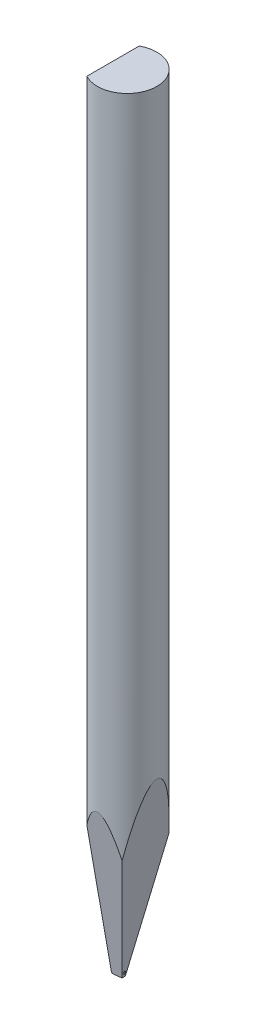
ISO-10303-21;
HEADER;
FILE_DESCRIPTION(('STEP AP214'),'2;1');
FILE_NAME('part.step','',(''),(''),'','','');
FILE_SCHEMA(('AUTOMOTIVE_DESIGN { 1 0 10303 214 1 1 1 1 }'));
ENDSEC;
DATA;
#1=APPLICATION_CONTEXT('core data for automotive mechanical design processes');
#2=APPLICATION_PROTOCOL_DEFINITION('international standard','automotive_design',2000,#1);
#3=PRODUCT_CONTEXT('',#1,'mechanical');
#4=PRODUCT('Part','Part','',(#3));
#5=PRODUCT_RELATED_PRODUCT_CATEGORY('part','',(#4));
#6=PRODUCT_DEFINITION_FORMATION('','',#4);
#7=PRODUCT_DEFINITION_CONTEXT('part definition',#1,'design');
#8=PRODUCT_DEFINITION('design','',#6,#7);
#9=PRODUCT_DEFINITION_SHAPE('','',#8);
#10=(LENGTH_UNIT() NAMED_UNIT(*) SI_UNIT(.MILLI.,.METRE.));
#11=(NAMED_UNIT(*) PLANE_ANGLE_UNIT() SI_UNIT($,.RADIAN.));
#12=(NAMED_UNIT(*) SI_UNIT($,.STERADIAN.) SOLID_ANGLE_UNIT());
#13=UNCERTAINTY_MEASURE_WITH_UNIT(LENGTH_MEASURE(1.E-05),#10,'distance_accuracy_value','');
#14=(GEOMETRIC_REPRESENTATION_CONTEXT(3) GLOBAL_UNCERTAINTY_ASSIGNED_CONTEXT((#13)) GLOBAL_UNIT_ASSIGNED_CONTEXT((#10,
#11,#12)) REPRESENTATION_CONTEXT('',''));
#15=CARTESIAN_POINT('',(0.,0.,0.));
#16=DIRECTION('',(0.,0.,1.));
#17=DIRECTION('',(1.,0.,0.));
#18=AXIS2_PLACEMENT_3D('',#15,#16,#17);
#19=CARTESIAN_POINT('',(-0.29972,0.,27.2760283406468));
#20=DIRECTION('',(-0.139173100960066,0.99026806874157,0.));
#21=DIRECTION('',(-0.99026806874157,-0.139173100960066,0.));
#22=AXIS2_PLACEMENT_3D('',#19,#20,#21);
#23=PLANE('',#22);
#24=DIRECTION('',(-0.99026806874157,-0.139173100960066,0.));
#25=VECTOR('',#24,1.);
#26=CARTESIAN_POINT('',(-0.29972,0.,0.0190499999999996));
#27=LINE('',#26,#25);
#28=CARTESIAN_POINT('',(-0.182120032,0.0165275976636946,0.0190499999999998));
#29=VERTEX_POINT('',#28);
#30=CARTESIAN_POINT('',(-0.284229745342368,0.00217701331933743,0.01905));
#31=VERTEX_POINT('',#30);
#32=EDGE_CURVE('E183',#29,#31,#27,.T.);
#33=ORIENTED_EDGE('',*,*,#32,.F.);
#34=DIRECTION('',(0.,0.,1.));
#35=VECTOR('',#34,1.);
#36=CARTESIAN_POINT('',(-0.182120032,0.0165275976636946,27.2760283406468));
#37=LINE('',#36,#35);
#38=CARTESIAN_POINT('',(-0.182120032,0.0165275976636946,-0.0190499999999998));
#39=VERTEX_POINT('',#38);
#40=EDGE_CURVE('E11',#39,#29,#37,.T.);
#41=ORIENTED_EDGE('',*,*,#40,.F.);
#42=DIRECTION('',(-0.99026806874157,-0.139173100960066,0.));
#43=VECTOR('',#42,1.);
#44=CARTESIAN_POINT('',(-0.29972,0.,-0.0190499999999996));
#45=LINE('',#44,#43);
#46=CARTESIAN_POINT('',(-0.284229745342368,0.00217701331933743,-0.01905));
#47=VERTEX_POINT('',#46);
#48=EDGE_CURVE('E147',#39,#47,#45,.T.);
#49=ORIENTED_EDGE('',*,*,#48,.T.);
#50=CARTESIAN_POINT('',(-1.76000710043308,-0.205229968,0.));
#51=DIRECTION('',(-0.139173100960066,0.99026806874157,0.));
#52=DIRECTION('',(-0.99026806874157,-0.139173100960066,0.));
#53=AXIS2_PLACEMENT_3D('',#50,#51,#52);
#54=ELLIPSE('',#53,1.49655356216977,0.20828);
#55=CARTESIAN_POINT('',(-0.29972000000001,0.,-0.035513640122057));
#56=VERTEX_POINT('',#55);
#57=EDGE_CURVE('E189',#47,#56,#54,.T.);
#58=ORIENTED_EDGE('',*,*,#57,.T.);
#59=DIRECTION('',(0.,0.,-1.));
#60=VECTOR('',#59,1.);
#61=CARTESIAN_POINT('',(-0.29972,0.,27.2760283406468));
#62=LINE('',#61,#60);
#63=CARTESIAN_POINT('',(-0.299719999999996,0.,-0.0381));
#64=VERTEX_POINT('',#63);
#65=EDGE_CURVE('E207',#56,#64,#62,.T.);
#66=ORIENTED_EDGE('',*,*,#65,.T.);
#67=DIRECTION('',(0.98997002855162,0.139131214142995,-0.0245325869121374));
#68=VECTOR('',#67,1.);
#69=CARTESIAN_POINT('',(26.3315049185651,3.74277457920228,-0.698052141023137));
#70=LINE('',#69,#68);
#71=CARTESIAN_POINT('',(-0.0913565150909437,0.0292835780906194,-0.0432634849090593));
#72=VERTEX_POINT('',#71);
#73=EDGE_CURVE('E249',#64,#72,#70,.T.);
#74=ORIENTED_EDGE('',*,*,#73,.T.);
#75=DIRECTION('',(0.,0.,-1.));
#76=VECTOR('',#75,1.);
#77=CARTESIAN_POINT('',(-0.0913565150909408,0.0292835780906184,27.2760283406468));
#78=LINE('',#77,#76);
#79=CARTESIAN_POINT('',(-0.0913565150909437,0.0292835780906194,0.0432634849090593));
#80=VERTEX_POINT('',#79);
#81=EDGE_CURVE('E204',#80,#72,#78,.T.);
#82=ORIENTED_EDGE('',*,*,#81,.F.);
#83=DIRECTION('',(-0.98997002855162,-0.139131214142995,-0.0245325869121374));
#84=VECTOR('',#83,1.);
#85=CARTESIAN_POINT('',(26.3315049185651,3.74277457920228,0.698052141023137));
#86=LINE('',#85,#84);
#87=CARTESIAN_POINT('',(-0.299719999999996,0.,0.0381));
#88=VERTEX_POINT('',#87);
#89=EDGE_CURVE('E217',#80,#88,#86,.T.);
#90=ORIENTED_EDGE('',*,*,#89,.T.);
#91=CARTESIAN_POINT('',(-0.29972000000001,0.,0.035513640122057));
#92=VERTEX_POINT('',#91);
#93=EDGE_CURVE('E208',#88,#92,#62,.T.);
#94=ORIENTED_EDGE('',*,*,#93,.T.);
#95=EDGE_CURVE('E191',#92,#31,#54,.T.);
#96=ORIENTED_EDGE('',*,*,#95,.T.);
#97=EDGE_LOOP('',(#33,#41,#49,#58,#66,#74,#82,#90,#94,#96));
#98=FACE_BOUND('',#97,.T.);
#99=ADVANCED_FACE('F43',(#98),#23,.F.);
#100=CARTESIAN_POINT('',(26.8421219491216,-0.205229968,0.));
#101=DIRECTION('',(-1.,0.,0.));
#102=DIRECTION('',(0.,0.,1.));
#103=AXIS2_PLACEMENT_3D('',#100,#101,#102);
#104=CYLINDRICAL_SURFACE('',#103,0.20828);
#105=DIRECTION('',(-1.,0.,0.));
#106=VECTOR('',#105,1.);
#107=CARTESIAN_POINT('',(26.8421219491216,0.00217701331933743,0.01905));
#108=LINE('',#107,#106);
#109=CARTESIAN_POINT('',(-0.296326350508201,0.00217701331934075,0.01905));
#110=VERTEX_POINT('',#109);
#111=EDGE_CURVE('E51',#31,#110,#108,.T.);
#112=ORIENTED_EDGE('',*,*,#111,.F.);
#113=ORIENTED_EDGE('',*,*,#95,.F.);
#114=DIRECTION('',(-1.,0.,0.));
#115=VECTOR('',#114,1.);
#116=CARTESIAN_POINT('',(26.8421219491216,0.,0.035513640122057));
#117=LINE('',#116,#115);
#118=CARTESIAN_POINT('',(-0.35052,0.,0.0355136401220951));
#119=VERTEX_POINT('',#118);
#120=EDGE_CURVE('E66',#92,#119,#117,.T.);
#121=ORIENTED_EDGE('',*,*,#120,.T.);
#122=CARTESIAN_POINT('',(-0.35052,0.,-0.0355136401220637));
#123=CARTESIAN_POINT('',(-0.350797395604418,-1.57400676627364E-07,-0.0355144568911877));
#124=CARTESIAN_POINT('',(-0.351073642816387,4.5377827047496E-06,-0.035487421708618));
#125=CARTESIAN_POINT('',(-0.351613263825735,2.21644221869214E-05,-0.0353853757902136));
#126=CARTESIAN_POINT('',(-0.351876759101891,3.49868149283125E-05,-0.0353110002844949));
#127=CARTESIAN_POINT('',(-0.35244979870468,7.13960743479532E-05,-0.0350987402298029));
#128=CARTESIAN_POINT('',(-0.35275505892223,9.68368252018304E-05,-0.034949843353549));
#129=CARTESIAN_POINT('',(-0.353338531097127,0.000155153990777931,-0.0346055071548817));
#130=CARTESIAN_POINT('',(-0.353616586126976,0.000188070279649302,-0.0344098179371281));
#131=CARTESIAN_POINT('',(-0.354322814135869,0.000282300913829212,-0.0338436443460087));
#132=CARTESIAN_POINT('',(-0.354726685485515,0.000347861473302922,-0.0334439163823284));
#133=CARTESIAN_POINT('',(-0.355472412413751,0.000484639813457646,-0.0325921696743602));
#134=CARTESIAN_POINT('',(-0.355814128424397,0.000555869821860981,-0.0321400368917526));
#135=CARTESIAN_POINT('',(-0.356974805419614,0.000818253829038452,-0.0304340274839467));
#136=CARTESIAN_POINT('',(-0.357652464954569,0.00101363589256459,-0.0290865433357066));
#137=CARTESIAN_POINT('',(-0.358817371111136,0.00138636623825021,-0.0263111620333282));
#138=CARTESIAN_POINT('',(-0.359303570197177,0.0015636114869725,-0.0248828700930591));
#139=CARTESIAN_POINT('',(-0.360894436268654,0.00217904710937099,-0.019443057777476));
#140=CARTESIAN_POINT('',(-0.361584668102874,0.00252849923342408,-0.0153023761550464));
#141=CARTESIAN_POINT('',(-0.362456628024893,0.00297714715962812,-0.00694333703675725));
#142=CARTESIAN_POINT('',(-0.362634670426027,0.00307452857573046,-0.00272463532371374));
#143=CARTESIAN_POINT('',(-0.362518404096607,0.0030130988304252,0.00595582510285886));
#144=CARTESIAN_POINT('',(-0.362194686999288,0.00283833421565539,0.010416749562991));
#145=CARTESIAN_POINT('',(-0.36091600701626,0.00220673224075402,0.0192117898923717));
#146=CARTESIAN_POINT('',(-0.359970737827828,0.00175423350911561,0.0235468022648287));
#147=CARTESIAN_POINT('',(-0.358048099187581,0.00114038766389879,0.0281458568754849));
#148=CARTESIAN_POINT('',(-0.357795803676435,0.00106283259586748,0.0287081317721685));
#149=CARTESIAN_POINT('',(-0.357249650864011,0.000905955011840022,0.0298135012280328));
#150=CARTESIAN_POINT('',(-0.356955715689955,0.000826629424335999,0.0303565574112618));
#151=CARTESIAN_POINT('',(-0.356315014780153,0.000667698813082343,0.0314165582917925));
#152=CARTESIAN_POINT('',(-0.355967871556471,0.000588096114296238,0.031933278166191));
#153=CARTESIAN_POINT('',(-0.355207020712523,0.000433153557137812,0.0329162976166374));
#154=CARTESIAN_POINT('',(-0.354793509697868,0.000357801970001448,0.033382739514937));
#155=CARTESIAN_POINT('',(-0.354100819675329,0.000252552869997975,0.034022672869181));
#156=CARTESIAN_POINT('',(-0.353852907593938,0.000218246965712038,0.0342290325488683));
#157=CARTESIAN_POINT('',(-0.353331597329311,0.000154725960642612,0.0346081270678385));
#158=CARTESIAN_POINT('',(-0.353058216503108,0.00012550743119591,0.0347808845627593));
#159=CARTESIAN_POINT('',(-0.352527407592248,7.82570555704721E-05,0.0350586395909549));
#160=CARTESIAN_POINT('',(-0.352273343313951,5.92205484808112E-05,0.0351698100115295));
#161=CARTESIAN_POINT('',(-0.351750156654139,2.84660364555167E-05,0.0353488626663096));
#162=CARTESIAN_POINT('',(-0.35148107897909,1.6727447593476E-05,0.0354168666637885));
#163=CARTESIAN_POINT('',(-0.351094473723724,6.23977938820673E-06,0.0354775660166442));
#164=CARTESIAN_POINT('',(-0.350980076378248,3.9077513811912E-06,0.035491051824929));
#165=CARTESIAN_POINT('',(-0.3507504739734,7.85967139598533E-07,0.0355090985386168));
#166=CARTESIAN_POINT('',(-0.350635268369774,-2.62422891388475E-09,0.0355136527031143));
#167=CARTESIAN_POINT('',(-0.350520000000007,0.,0.0355136401220959));
#168=B_SPLINE_CURVE_WITH_KNOTS('',3,(#122,#123,#124,#125,#126,#127,#128,#129,#130,#131,#132,
#133,#134,#135,#136,#137,#138,#139,#140,#141,#142,#143,#144,#145,#146,#147,#148,#149,#150,#151,
#152,#153,#154,#155,#156,#157,#158,#159,#160,#161,#162,#163,#164,#165,#166,#167),.UNSPECIFIED.,
.F.,.F.,(4,2,2,2,2,2,2,2,2,2,2,2,2,2,2,2,2,2,2,2,2,2,4),(0.,0.00082898511173705,
0.00164707457581141,0.00266310797068402,0.00368469371342514,0.00539102536638813,
0.00710114246818894,0.0116288296658692,0.016180955962263,0.0287318481902675,0.0413728327438805,
0.0547831890336456,0.0679892065153241,0.0698512259506927,0.0717167747926306,0.073596230228404,
0.0754702174470305,0.0764413228544082,0.07741177122527,0.0782425960323278,0.0790710667215627,
0.0794163990914465,0.0797619919910252),.UNSPECIFIED.);
#169=CARTESIAN_POINT('',(-0.350519999999986,0.,-0.035513640122057));
#170=VERTEX_POINT('',#169);
#171=EDGE_CURVE('E255',#170,#119,#168,.T.);
#172=ORIENTED_EDGE('',*,*,#171,.F.);
#173=DIRECTION('',(-1.,0.,0.));
#174=VECTOR('',#173,1.);
#175=CARTESIAN_POINT('',(26.8421219491216,0.,-0.035513640122057));
#176=LINE('',#175,#174);
#177=EDGE_CURVE('E186',#56,#170,#176,.T.);
#178=ORIENTED_EDGE('',*,*,#177,.F.);
#179=ORIENTED_EDGE('',*,*,#57,.F.);
#180=DIRECTION('',(-1.,0.,0.));
#181=VECTOR('',#180,1.);
#182=CARTESIAN_POINT('',(26.8421219491216,0.00217701331933743,-0.01905));
#183=LINE('',#182,#181);
#184=CARTESIAN_POINT('',(-0.296326350508202,0.00217701331933977,-0.01905));
#185=VERTEX_POINT('',#184);
#186=EDGE_CURVE('E263',#47,#185,#183,.T.);
#187=ORIENTED_EDGE('',*,*,#186,.T.);
#188=CARTESIAN_POINT('',(-0.296326350508208,0.00217701331933973,-0.01905));
#189=CARTESIAN_POINT('',(-0.2979370201968,0.00217638861984402,-0.0190499599804176));
#190=CARTESIAN_POINT('',(-0.299552270038364,0.00218895032965483,-0.0189195590392055));
#191=CARTESIAN_POINT('',(-0.302746326102882,0.00223741355415941,-0.0183844991807153));
#192=CARTESIAN_POINT('',(-0.304324834810165,0.00227346316376566,-0.0179780993537728));
#193=CARTESIAN_POINT('',(-0.307062374895197,0.00235625506102979,-0.0169909566402586));
#194=CARTESIAN_POINT('',(-0.308240676653651,0.00239924761854192,-0.0164636049973455));
#195=CARTESIAN_POINT('',(-0.310492895235132,0.00249379148254957,-0.015224557675242));
#196=CARTESIAN_POINT('',(-0.311567111966831,0.0025453169650662,-0.0145134146868618));
#197=CARTESIAN_POINT('',(-0.3134110825593,0.00264274265040389,-0.0130364449859837));
#198=CARTESIAN_POINT('',(-0.314202101077463,0.00268823825968299,-0.0122971972909205));
#199=CARTESIAN_POINT('',(-0.315651825720142,0.00277669125191825,-0.0106971465580728));
#200=CARTESIAN_POINT('',(-0.316310513225221,0.00281964827708738,-0.00983632644360059));
#201=CARTESIAN_POINT('',(-0.317467580140747,0.00289820688348406,-0.00800407013694455));
#202=CARTESIAN_POINT('',(-0.31796491845446,0.0029337601856835,-0.00703196826453249));
#203=CARTESIAN_POINT('',(-0.318764091941178,0.00299221117515115,-0.00501003162903668));
#204=CARTESIAN_POINT('',(-0.319066080992087,0.00301511882139513,-0.00396025877611212));
#205=CARTESIAN_POINT('',(-0.319431966911504,0.00304306067436832,-0.00194808563104231));
#206=CARTESIAN_POINT('',(-0.319519778285864,0.00304988681363937,-0.000990016018748115));
#207=CARTESIAN_POINT('',(-0.319523494729633,0.00305017231276882,0.000926287242984975));
#208=CARTESIAN_POINT('',(-0.319439464279017,0.00304363668634465,0.00188452069604034));
#209=CARTESIAN_POINT('',(-0.319113574392244,0.00301874283812384,0.00371875803820541));
#210=CARTESIAN_POINT('',(-0.318880652544413,0.00300105483967922,0.00459638550817856));
#211=CARTESIAN_POINT('',(-0.318276669751707,0.00295641235978938,0.00630223426588325));
#212=CARTESIAN_POINT('',(-0.317905599185079,0.0029294572329191,0.00713045210768037));
#213=CARTESIAN_POINT('',(-0.317023379821358,0.00286772496438596,0.00875181065388879));
#214=CARTESIAN_POINT('',(-0.316507163673647,0.00283267509919733,0.00954216962056271));
#215=CARTESIAN_POINT('',(-0.315362305995984,0.00275878326611728,0.0110362377017429));
#216=CARTESIAN_POINT('',(-0.314733622302455,0.0027199398785398,0.0117399141517211));
#217=CARTESIAN_POINT('',(-0.313306429962601,0.00263717950509239,0.0131280569009672));
#218=CARTESIAN_POINT('',(-0.312496697584698,0.00259319402910256,0.0138009484732618));
#219=CARTESIAN_POINT('',(-0.310789404235382,0.00250838322829826,0.0150237336659098));
#220=CARTESIAN_POINT('',(-0.309891801799207,0.002467559411864,0.0155735688114207));
#221=CARTESIAN_POINT('',(-0.307878944060331,0.00238583886036622,0.0166300672589728));
#222=CARTESIAN_POINT('',(-0.306752148845399,0.00234603045810652,0.0171148235125245));
#223=CARTESIAN_POINT('',(-0.304441501353053,0.00227802941023905,0.0179210151461852));
#224=CARTESIAN_POINT('',(-0.303257601738253,0.00224984659327268,0.018242312386135));
#225=CARTESIAN_POINT('',(-0.300173431352377,0.00219419908152984,0.0188642308497813));
#226=CARTESIAN_POINT('',(-0.298248666894496,0.00217625818826451,0.0190491735545892));
#227=CARTESIAN_POINT('',(-0.296326350509384,0.00217701331880747,0.0190500000057843));
#228=B_SPLINE_CURVE_WITH_KNOTS('',3,(#188,#189,#190,#191,#192,#193,#194,#195,#196,#197,#198,
#199,#200,#201,#202,#203,#204,#205,#206,#207,#208,#209,#210,#211,#212,#213,#214,#215,#216,#217,
#218,#219,#220,#221,#222,#223,#224,#225,#226,#227),.UNSPECIFIED.,.F.,.F.,(4,2,2,2,2,2,2,2,2,2,2,
2,2,2,2,2,2,2,2,4),(0.,0.00483435331638846,0.00969948687901215,0.0135591231722066,
0.0174072852840063,0.0206448801720834,0.0238829302825508,0.0271414763595555,0.0303974525226192,
0.0332687447244345,0.0361389597328663,0.0388512647792233,0.0415637587669982,0.0443861785580359,
0.047209658687515,0.0503587647694656,0.0535093641041172,0.0571772041786726,0.0608481388383786,
0.0666067931230067),.UNSPECIFIED.);
#229=EDGE_CURVE('E278',#185,#110,#228,.T.);
#230=ORIENTED_EDGE('',*,*,#229,.T.);
#231=EDGE_LOOP('',(#112,#113,#121,#172,#178,#179,#187,#230));
#232=FACE_BOUND('',#231,.T.);
#233=ADVANCED_FACE('F268',(#232),#104,.F.);
#234=CARTESIAN_POINT('',(0.,0.,0.));
#235=DIRECTION('',(0.,1.,0.));
#236=DIRECTION('',(0.,0.,1.));
#237=AXIS2_PLACEMENT_3D('',#234,#235,#236);
#238=PLANE('',#237);
#239=ORIENTED_EDGE('',*,*,#120,.F.);
#240=ORIENTED_EDGE('',*,*,#93,.F.);
#241=DIRECTION('',(-1.,0.,0.));
#242=VECTOR('',#241,1.);
#243=CARTESIAN_POINT('',(26.8738719491216,0.,0.0381));
#244=LINE('',#243,#242);
#245=CARTESIAN_POINT('',(-0.35052,0.,0.0380999999999974));
#246=VERTEX_POINT('',#245);
#247=EDGE_CURVE('E220',#88,#246,#244,.T.);
#248=ORIENTED_EDGE('',*,*,#247,.T.);
#249=DIRECTION('',(0.,0.,-1.));
#250=VECTOR('',#249,1.);
#251=CARTESIAN_POINT('',(-0.35052,0.,26.4515969491216));
#252=LINE('',#251,#250);
#253=EDGE_CURVE('E195',#246,#119,#252,.T.);
#254=ORIENTED_EDGE('',*,*,#253,.T.);
#255=EDGE_LOOP('',(#239,#240,#248,#254));
#256=FACE_BOUND('',#255,.T.);
#257=ADVANCED_FACE('F272',(#256),#238,.F.);
#258=CARTESIAN_POINT('',(26.8738719491216,0.,0.0381));
#259=DIRECTION('',(0.,-0.173648177666931,0.984807753012208));
#260=DIRECTION('',(0.,-0.984807753012208,-0.173648177666931));
#261=AXIS2_PLACEMENT_3D('',#258,#259,#260);
#262=PLANE('',#261);
#263=CARTESIAN_POINT('',(-0.35052,0.0254,0.0425787053099924));
#264=DIRECTION('',(0.,-0.173648177666931,0.984807753012208));
#265=DIRECTION('',(0.,-0.984807753012208,-0.173648177666931));
#266=AXIS2_PLACEMENT_3D('',#263,#264,#265);
#267=ELLIPSE('',#266,0.0257918359418979,0.0254);
#268=CARTESIAN_POINT('',(-0.37592,0.0254,0.0425787053099924));
#269=VERTEX_POINT('',#268);
#270=EDGE_CURVE('E198',#246,#269,#267,.F.);
#271=ORIENTED_EDGE('',*,*,#270,.F.);
#272=ORIENTED_EDGE('',*,*,#247,.F.);
#273=ORIENTED_EDGE('',*,*,#89,.F.);
#274=DIRECTION('',(-0.171087869746036,-0.970287525247814,-0.171087869746036));
#275=VECTOR('',#274,1.);
#276=CARTESIAN_POINT('',(0.692931938695088,4.47720442738341,0.827551938695093));
#277=LINE('',#276,#275);
#278=CARTESIAN_POINT('',(0.489000739694998,3.32065312604136,0.623620739695003));
#279=VERTEX_POINT('',#278);
#280=EDGE_CURVE('E214',#279,#80,#277,.T.);
#281=ORIENTED_EDGE('',*,*,#280,.F.);
#282=CARTESIAN_POINT('',(0.,-0.216075837327433,0.));
#283=DIRECTION('',(0.,-0.173648177666931,0.984807753012208));
#284=DIRECTION('',(0.,-0.984807753012208,-0.173648177666931));
#285=AXIS2_PLACEMENT_3D('',#282,#283,#284);
#286=ELLIPSE('',#285,4.56371043248163,0.792479999999998);
#287=CARTESIAN_POINT('',(-0.37592,3.74046620982329,0.69764511322018));
#288=VERTEX_POINT('',#287);
#289=EDGE_CURVE('E226',#279,#288,#286,.T.);
#290=ORIENTED_EDGE('',*,*,#289,.T.);
#291=DIRECTION('',(0.,0.984807753012208,0.173648177666931));
#292=VECTOR('',#291,1.);
#293=CARTESIAN_POINT('',(-0.37592,20.2115576196122,3.60194293048141));
#294=LINE('',#293,#292);
#295=EDGE_CURVE('E241',#269,#288,#294,.T.);
#296=ORIENTED_EDGE('',*,*,#295,.F.);
#297=EDGE_LOOP('',(#271,#272,#273,#281,#290,#296));
#298=FACE_BOUND('',#297,.T.);
#299=ADVANCED_FACE('F304',(#298),#262,.T.);
#300=CARTESIAN_POINT('',(26.8738719491216,0.,-0.0381));
#301=DIRECTION('',(0.,-0.173648177666931,-0.984807753012208));
#302=DIRECTION('',(0.,0.984807753012208,-0.173648177666931));
#303=AXIS2_PLACEMENT_3D('',#300,#301,#302);
#304=PLANE('',#303);
#305=CARTESIAN_POINT('',(-0.35052,0.0254,-0.0425787053099959));
#306=DIRECTION('',(0.,-0.173648177666931,-0.984807753012208));
#307=DIRECTION('',(0.,0.984807753012208,-0.173648177666931));
#308=AXIS2_PLACEMENT_3D('',#305,#306,#307);
#309=ELLIPSE('',#308,0.0257918359418979,0.0254);
#310=CARTESIAN_POINT('',(-0.37592,0.0254,-0.0425787053099959));
#311=VERTEX_POINT('',#310);
#312=CARTESIAN_POINT('',(-0.35052,0.,-0.0380999999999992));
#313=VERTEX_POINT('',#312);
#314=EDGE_CURVE('E252',#311,#313,#309,.F.);
#315=ORIENTED_EDGE('',*,*,#314,.F.);
#316=DIRECTION('',(0.,-0.984807753012208,0.173648177666931));
#317=VECTOR('',#316,1.);
#318=CARTESIAN_POINT('',(-0.37592,20.5694748591997,-3.66505339668138));
#319=LINE('',#318,#317);
#320=CARTESIAN_POINT('',(-0.37592,3.74046620982329,-0.69764511322018));
#321=VERTEX_POINT('',#320);
#322=EDGE_CURVE('E243',#321,#311,#319,.T.);
#323=ORIENTED_EDGE('',*,*,#322,.F.);
#324=CARTESIAN_POINT('',(0.,-0.216075837327433,0.));
#325=DIRECTION('',(0.,-0.173648177666931,-0.984807753012208));
#326=DIRECTION('',(0.,-0.984807753012208,0.173648177666931));
#327=AXIS2_PLACEMENT_3D('',#324,#325,#326);
#328=ELLIPSE('',#327,4.56371043248163,0.792479999999998);
#329=CARTESIAN_POINT('',(0.489000739694998,3.32065312604136,-0.623620739695003));
#330=VERTEX_POINT('',#329);
#331=EDGE_CURVE('E229',#321,#330,#328,.T.);
#332=ORIENTED_EDGE('',*,*,#331,.T.);
#333=DIRECTION('',(0.171087869746036,0.970287525247814,-0.171087869746036));
#334=VECTOR('',#333,1.);
#335=CARTESIAN_POINT('',(0.692931938695088,4.47720442738341,-0.827551938695093));
#336=LINE('',#335,#334);
#337=EDGE_CURVE('E246',#72,#330,#336,.T.);
#338=ORIENTED_EDGE('',*,*,#337,.F.);
#339=ORIENTED_EDGE('',*,*,#73,.F.);
#340=DIRECTION('',(-1.,0.,0.));
#341=VECTOR('',#340,1.);
#342=CARTESIAN_POINT('',(26.8738719491216,0.,-0.0381));
#343=LINE('',#342,#341);
#344=EDGE_CURVE('E223',#64,#313,#343,.T.);
#345=ORIENTED_EDGE('',*,*,#344,.T.);
#346=EDGE_LOOP('',(#315,#323,#332,#338,#339,#345));
#347=FACE_BOUND('',#346,.T.);
#348=ADVANCED_FACE('F312',(#347),#304,.T.);
#349=ORIENTED_EDGE('',*,*,#65,.F.);
#350=ORIENTED_EDGE('',*,*,#177,.T.);
#351=EDGE_CURVE('E199',#170,#313,#252,.T.);
#352=ORIENTED_EDGE('',*,*,#351,.T.);
#353=ORIENTED_EDGE('',*,*,#344,.F.);
#354=EDGE_LOOP('',(#349,#350,#352,#353));
#355=FACE_BOUND('',#354,.T.);
#356=ADVANCED_FACE('F314',(#355),#238,.F.);
#357=CARTESIAN_POINT('',(0.,21.0312,0.));
#358=DIRECTION('',(0.,-1.,0.));
#359=DIRECTION('',(0.,0.,-1.));
#360=AXIS2_PLACEMENT_3D('',#357,#358,#359);
#361=CYLINDRICAL_SURFACE('',#360,0.792479999999998);
#362=ORIENTED_EDGE('',*,*,#289,.F.);
#363=CARTESIAN_POINT('',(0.,0.547392121229499,0.));
#364=DIRECTION('',(-0.984807753012208,0.173648177666931,0.));
#365=DIRECTION('',(-0.173648177666931,-0.984807753012208,0.));
#366=AXIS2_PLACEMENT_3D('',#363,#364,#365);
#367=ELLIPSE('',#366,4.56371043248165,0.792479999999998);
#368=EDGE_CURVE('E211',#279,#330,#367,.T.);
#369=ORIENTED_EDGE('',*,*,#368,.T.);
#370=ORIENTED_EDGE('',*,*,#331,.F.);
#371=DIRECTION('',(0.,-1.,0.));
#372=VECTOR('',#371,1.);
#373=CARTESIAN_POINT('',(-0.37592,21.0312,-0.69764511322018));
#374=LINE('',#373,#372);
#375=CARTESIAN_POINT('',(-0.37592,21.0312,-0.69764511322018));
#376=VERTEX_POINT('',#375);
#377=EDGE_CURVE('E235',#376,#321,#374,.T.);
#378=ORIENTED_EDGE('',*,*,#377,.F.);
#379=CARTESIAN_POINT('',(0.,21.0312,0.));
#380=DIRECTION('',(0.,1.,0.));
#381=DIRECTION('',(0.,0.,1.));
#382=AXIS2_PLACEMENT_3D('',#379,#380,#381);
#383=CIRCLE('',#382,0.792479999999998);
#384=CARTESIAN_POINT('',(-0.37592,21.0312,0.69764511322018));
#385=VERTEX_POINT('',#384);
#386=EDGE_CURVE('E238',#385,#376,#383,.T.);
#387=ORIENTED_EDGE('',*,*,#386,.F.);
#388=DIRECTION('',(0.,-1.,0.));
#389=VECTOR('',#388,1.);
#390=CARTESIAN_POINT('',(-0.37592,21.0312,0.69764511322018));
#391=LINE('',#390,#389);
#392=EDGE_CURVE('E233',#288,#385,#391,.F.);
#393=ORIENTED_EDGE('',*,*,#392,.F.);
#394=EDGE_LOOP('',(#362,#369,#370,#378,#387,#393));
#395=FACE_BOUND('',#394,.T.);
#396=ADVANCED_FACE('F45',(#395),#361,.T.);
#397=CARTESIAN_POINT('',(-0.37592,21.0312,-1.04648));
#398=DIRECTION('',(-1.,0.,0.));
#399=DIRECTION('',(0.,0.,1.));
#400=AXIS2_PLACEMENT_3D('',#397,#398,#399);
#401=PLANE('',#400);
#402=DIRECTION('',(0.,0.,-1.));
#403=VECTOR('',#402,1.);
#404=CARTESIAN_POINT('',(-0.37592,0.0254,26.4515969491216));
#405=LINE('',#404,#403);
#406=EDGE_CURVE('E194',#269,#311,#405,.T.);
#407=ORIENTED_EDGE('',*,*,#406,.F.);
#408=ORIENTED_EDGE('',*,*,#295,.T.);
#409=ORIENTED_EDGE('',*,*,#392,.T.);
#410=DIRECTION('',(0.,0.,-1.));
#411=VECTOR('',#410,1.);
#412=CARTESIAN_POINT('',(-0.37592,21.0312,-1.04648));
#413=LINE('',#412,#411);
#414=EDGE_CURVE('E231',#385,#376,#413,.T.);
#415=ORIENTED_EDGE('',*,*,#414,.T.);
#416=ORIENTED_EDGE('',*,*,#377,.T.);
#417=ORIENTED_EDGE('',*,*,#322,.T.);
#418=EDGE_LOOP('',(#407,#408,#409,#415,#416,#417));
#419=FACE_BOUND('',#418,.T.);
#420=ADVANCED_FACE('F320',(#419),#401,.T.);
#421=CARTESIAN_POINT('',(0.,21.0312,0.));
#422=DIRECTION('',(0.,1.,0.));
#423=DIRECTION('',(0.,0.,1.));
#424=AXIS2_PLACEMENT_3D('',#421,#422,#423);
#425=PLANE('',#424);
#426=ORIENTED_EDGE('',*,*,#386,.T.);
#427=ORIENTED_EDGE('',*,*,#414,.F.);
#428=EDGE_LOOP('',(#426,#427));
#429=FACE_BOUND('',#428,.T.);
#430=ADVANCED_FACE('F293',(#429),#425,.T.);
#431=CARTESIAN_POINT('',(-0.0913565150909408,0.0292835780906184,27.2760283406468));
#432=DIRECTION('',(-0.984807753012208,0.173648177666931,0.));
#433=DIRECTION('',(-0.173648177666931,-0.984807753012208,0.));
#434=AXIS2_PLACEMENT_3D('',#431,#432,#433);
#435=PLANE('',#434);
#436=CARTESIAN_POINT('',(-0.0721982555385536,0.137935467185589,0.));
#437=DIRECTION('',(-0.984807753012208,0.173648177666931,0.));
#438=DIRECTION('',(0.173648177666931,0.984807753012208,0.));
#439=AXIS2_PLACEMENT_3D('',#436,#437,#438);
#440=ELLIPSE('',#439,0.0439502823592256,0.0315688581959235);
#441=CARTESIAN_POINT('',(-0.064566369098927,0.18121804600003,0.));
#442=VERTEX_POINT('',#441);
#443=EDGE_CURVE('E185',#442,#442,#440,.F.);
#444=ORIENTED_EDGE('',*,*,#443,.F.);
#445=EDGE_LOOP('',(#444));
#446=FACE_BOUND('',#445,.T.);
#447=ORIENTED_EDGE('',*,*,#368,.F.);
#448=ORIENTED_EDGE('',*,*,#280,.T.);
#449=ORIENTED_EDGE('',*,*,#81,.T.);
#450=ORIENTED_EDGE('',*,*,#337,.T.);
#451=EDGE_LOOP('',(#447,#448,#449,#450));
#452=FACE_BOUND('',#451,.T.);
#453=ADVANCED_FACE('F290',(#446,#452),#435,.F.);
#454=CARTESIAN_POINT('',(-0.35052,0.0254,26.4515969491216));
#455=DIRECTION('',(0.,0.,-1.));
#456=DIRECTION('',(-1.,0.,0.));
#457=AXIS2_PLACEMENT_3D('',#454,#455,#456);
#458=CYLINDRICAL_SURFACE('',#457,0.0254);
#459=ORIENTED_EDGE('',*,*,#351,.F.);
#460=ORIENTED_EDGE('',*,*,#171,.T.);
#461=ORIENTED_EDGE('',*,*,#253,.F.);
#462=ORIENTED_EDGE('',*,*,#270,.T.);
#463=ORIENTED_EDGE('',*,*,#406,.T.);
#464=ORIENTED_EDGE('',*,*,#314,.T.);
#465=EDGE_LOOP('',(#459,#460,#461,#462,#463,#464));
#466=FACE_BOUND('',#465,.T.);
#467=ADVANCED_FACE('F265',(#466),#458,.T.);
#468=CARTESIAN_POINT('',(-0.182120032,0.0609600000000001,0.01905));
#469=DIRECTION('',(-1.,0.,0.));
#470=DIRECTION('',(0.,0.,1.));
#471=AXIS2_PLACEMENT_3D('',#468,#469,#470);
#472=PLANE('',#471);
#473=ORIENTED_EDGE('',*,*,#40,.T.);
#474=DIRECTION('',(0.,1.,0.));
#475=VECTOR('',#474,1.);
#476=CARTESIAN_POINT('',(-0.182120032,0.0609600000000001,0.01905));
#477=LINE('',#476,#475);
#478=CARTESIAN_POINT('',(-0.182120032,0.0609600000000001,0.01905));
#479=VERTEX_POINT('',#478);
#480=EDGE_CURVE('E157',#29,#479,#477,.T.);
#481=ORIENTED_EDGE('',*,*,#480,.T.);
#482=CARTESIAN_POINT('',(-0.182120032,0.0609600000000001,0.));
#483=DIRECTION('',(-1.,0.,0.));
#484=DIRECTION('',(0.,1.,0.));
#485=AXIS2_PLACEMENT_3D('',#482,#483,#484);
#486=ELLIPSE('',#485,0.0219970452561247,0.01905);
#487=CARTESIAN_POINT('',(-0.182120032,0.0609600000000001,-0.01905));
#488=VERTEX_POINT('',#487);
#489=EDGE_CURVE('E153',#479,#488,#486,.F.);
#490=ORIENTED_EDGE('',*,*,#489,.T.);
#491=DIRECTION('',(0.,1.,0.));
#492=VECTOR('',#491,1.);
#493=CARTESIAN_POINT('',(-0.182120032,0.0609600000000001,-0.01905));
#494=LINE('',#493,#492);
#495=EDGE_CURVE('E141',#39,#488,#494,.T.);
#496=ORIENTED_EDGE('',*,*,#495,.F.);
#497=EDGE_LOOP('',(#473,#481,#490,#496));
#498=FACE_BOUND('',#497,.T.);
#499=ADVANCED_FACE('F155',(#498),#472,.T.);
#500=CARTESIAN_POINT('',(-0.0969099518218485,0.110156062728525,0.));
#501=DIRECTION('',(0.866025403784441,0.499999999999995,0.));
#502=DIRECTION('',(-0.499999999999995,0.866025403784441,0.));
#503=AXIS2_PLACEMENT_3D('',#500,#501,#502);
#504=CONICAL_SURFACE('',#503,0.01905,0.392699081698725);
#505=CARTESIAN_POINT('',(-0.0969099518218485,0.110156062728525,0.));
#506=DIRECTION('',(0.866025403784441,0.499999999999995,0.));
#507=DIRECTION('',(-0.499999999999995,0.866025403784441,0.));
#508=AXIS2_PLACEMENT_3D('',#505,#506,#507);
#509=CIRCLE('',#508,0.01905);
#510=CARTESIAN_POINT('',(-0.106434951821848,0.126653846670618,0.));
#511=VERTEX_POINT('',#510);
#512=EDGE_CURVE('E161',#511,#511,#509,.T.);
#513=ORIENTED_EDGE('',*,*,#512,.F.);
#514=EDGE_LOOP('',(#513));
#515=FACE_BOUND('',#514,.T.);
#516=ORIENTED_EDGE('',*,*,#443,.T.);
#517=EDGE_LOOP('',(#516));
#518=FACE_BOUND('',#517,.T.);
#519=ADVANCED_FACE('F288',(#515,#518),#504,.F.);
#520=CARTESIAN_POINT('',(-0.252030192817857,0.0609600000000001,0.));
#521=DIRECTION('',(-0.601815023152052,-0.79863551004729,0.));
#522=DIRECTION('',(0.79863551004729,-0.601815023152052,0.));
#523=AXIS2_PLACEMENT_3D('',#520,#521,#522);
#524=CYLINDRICAL_SURFACE('',#523,0.01905);
#525=DIRECTION('',(0.601815023152052,0.79863551004729,0.));
#526=VECTOR('',#525,1.);
#527=CARTESIAN_POINT('',(-0.252030192817857,0.0609600000000001,-0.01905));
#528=LINE('',#527,#526);
#529=CARTESIAN_POINT('',(-0.252030192817857,0.0609600000000001,-0.01905));
#530=VERTEX_POINT('',#529);
#531=EDGE_CURVE('E58',#185,#530,#528,.T.);
#532=ORIENTED_EDGE('',*,*,#531,.T.);
#533=CARTESIAN_POINT('',(-0.252030192817857,0.0609600000000001,0.));
#534=DIRECTION('',(0.,-1.,0.));
#535=DIRECTION('',(-1.,0.,0.));
#536=AXIS2_PLACEMENT_3D('',#533,#534,#535);
#537=ELLIPSE('',#536,0.0238531842878762,0.01905);
#538=CARTESIAN_POINT('',(-0.252030192817857,0.0609600000000001,0.01905));
#539=VERTEX_POINT('',#538);
#540=EDGE_CURVE('E170',#530,#539,#537,.F.);
#541=ORIENTED_EDGE('',*,*,#540,.T.);
#542=DIRECTION('',(-0.601815023152052,-0.79863551004729,0.));
#543=VECTOR('',#542,1.);
#544=CARTESIAN_POINT('',(-0.190048820868309,0.143212058682576,0.01905));
#545=LINE('',#544,#543);
#546=EDGE_CURVE('E177',#539,#110,#545,.T.);
#547=ORIENTED_EDGE('',*,*,#546,.T.);
#548=ORIENTED_EDGE('',*,*,#229,.F.);
#549=EDGE_LOOP('',(#532,#541,#547,#548));
#550=FACE_BOUND('',#549,.T.);
#551=ADVANCED_FACE('F274',(#550),#524,.F.);
#552=CARTESIAN_POINT('',(0.,0.,0.01905));
#553=DIRECTION('',(0.,0.,-1.));
#554=DIRECTION('',(-1.,0.,0.));
#555=AXIS2_PLACEMENT_3D('',#552,#553,#554);
#556=PLANE('',#555);
#557=ORIENTED_EDGE('',*,*,#32,.T.);
#558=ORIENTED_EDGE('',*,*,#111,.T.);
#559=ORIENTED_EDGE('',*,*,#546,.F.);
#560=DIRECTION('',(-1.,0.,0.));
#561=VECTOR('',#560,1.);
#562=CARTESIAN_POINT('',(-0.275883377105733,0.0609600000000001,0.01905));
#563=LINE('',#562,#561);
#564=EDGE_CURVE('E150',#479,#539,#563,.T.);
#565=ORIENTED_EDGE('',*,*,#564,.F.);
#566=ORIENTED_EDGE('',*,*,#480,.F.);
#567=EDGE_LOOP('',(#557,#558,#559,#565,#566));
#568=FACE_BOUND('',#567,.T.);
#569=ADVANCED_FACE('F437',(#568),#556,.T.);
#570=CARTESIAN_POINT('',(0.,0.,-0.01905));
#571=DIRECTION('',(0.,0.,-1.));
#572=DIRECTION('',(-1.,0.,0.));
#573=AXIS2_PLACEMENT_3D('',#570,#571,#572);
#574=PLANE('',#573);
#575=ORIENTED_EDGE('',*,*,#495,.T.);
#576=DIRECTION('',(-1.,0.,0.));
#577=VECTOR('',#576,1.);
#578=CARTESIAN_POINT('',(-0.275883377105733,0.0609600000000001,-0.01905));
#579=LINE('',#578,#577);
#580=EDGE_CURVE('E145',#488,#530,#579,.T.);
#581=ORIENTED_EDGE('',*,*,#580,.T.);
#582=ORIENTED_EDGE('',*,*,#531,.F.);
#583=ORIENTED_EDGE('',*,*,#186,.F.);
#584=ORIENTED_EDGE('',*,*,#48,.F.);
#585=EDGE_LOOP('',(#575,#581,#582,#583,#584));
#586=FACE_BOUND('',#585,.T.);
#587=ADVANCED_FACE('F143',(#586),#574,.F.);
#588=CARTESIAN_POINT('',(-0.275883377105733,0.0609600000000001,0.01905));
#589=DIRECTION('',(0.,-1.,0.));
#590=DIRECTION('',(0.,0.,-1.));
#591=AXIS2_PLACEMENT_3D('',#588,#589,#590);
#592=PLANE('',#591);
#593=ORIENTED_EDGE('',*,*,#580,.F.);
#594=CARTESIAN_POINT('',(-0.182120032,0.0609600000000001,0.));
#595=DIRECTION('',(0.,-1.,0.));
#596=DIRECTION('',(1.,0.,0.));
#597=AXIS2_PLACEMENT_3D('',#594,#595,#596);
#598=ELLIPSE('',#597,0.0381000000000004,0.01905);
#599=EDGE_CURVE('E162',#488,#479,#598,.F.);
#600=ORIENTED_EDGE('',*,*,#599,.T.);
#601=ORIENTED_EDGE('',*,*,#564,.T.);
#602=ORIENTED_EDGE('',*,*,#540,.F.);
#603=EDGE_LOOP('',(#593,#600,#601,#602));
#604=FACE_BOUND('',#603,.T.);
#605=ADVANCED_FACE('F169',(#604),#592,.T.);
#606=CARTESIAN_POINT('',(-0.315023537114919,-0.0157718744543423,0.));
#607=DIRECTION('',(0.866025403784441,0.499999999999995,0.));
#608=DIRECTION('',(-0.499999999999995,0.866025403784441,0.));
#609=AXIS2_PLACEMENT_3D('',#606,#607,#608);
#610=CYLINDRICAL_SURFACE('',#609,0.01905);
#611=ORIENTED_EDGE('',*,*,#512,.T.);
#612=EDGE_LOOP('',(#611));
#613=FACE_BOUND('',#612,.T.);
#614=ORIENTED_EDGE('',*,*,#489,.F.);
#615=ORIENTED_EDGE('',*,*,#599,.F.);
#616=EDGE_LOOP('',(#614,#615));
#617=FACE_BOUND('',#616,.T.);
#618=ADVANCED_FACE('F164',(#613,#617),#610,.F.);
#619=CLOSED_SHELL('',(#99,#233,#257,#299,#348,#356,#396,#420,#430,#453,#467,#499,#519,#551,#569,
#587,#605,#618));
#620=MANIFOLD_SOLID_BREP('B2',#619);
#621=ADVANCED_BREP_SHAPE_REPRESENTATION('',(#18,#620),#14);
#622=SHAPE_DEFINITION_REPRESENTATION(#9,#621);
ENDSEC;
END-ISO-10303-21;
